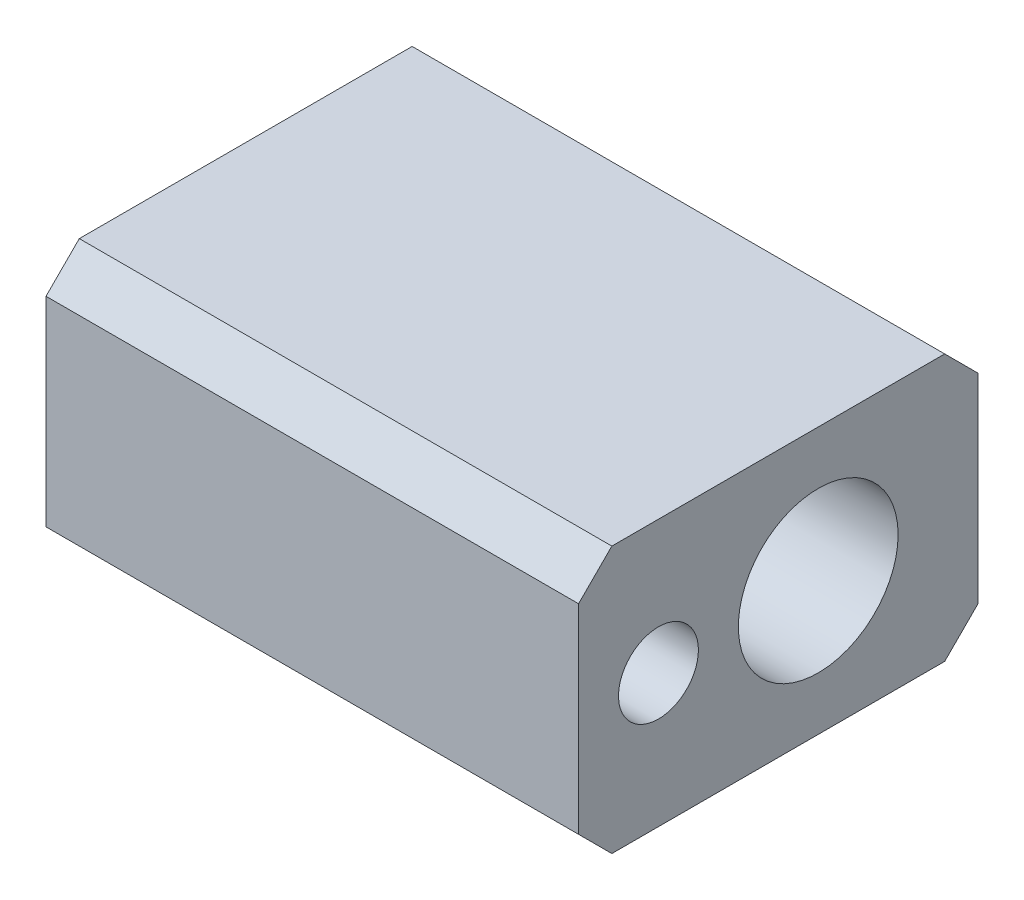
ISO-10303-21;
HEADER;
FILE_DESCRIPTION(('STEP AP214'),'2;1');
FILE_NAME('part.step','',(''),(''),'','','');
FILE_SCHEMA(('AUTOMOTIVE_DESIGN { 1 0 10303 214 1 1 1 1 }'));
ENDSEC;
DATA;
#1=APPLICATION_CONTEXT('core data for automotive mechanical design processes');
#2=APPLICATION_PROTOCOL_DEFINITION('international standard','automotive_design',2000,#1);
#3=PRODUCT_CONTEXT('',#1,'mechanical');
#4=PRODUCT('Part','Part','',(#3));
#5=PRODUCT_RELATED_PRODUCT_CATEGORY('part','',(#4));
#6=PRODUCT_DEFINITION_FORMATION('','',#4);
#7=PRODUCT_DEFINITION_CONTEXT('part definition',#1,'design');
#8=PRODUCT_DEFINITION('design','',#6,#7);
#9=PRODUCT_DEFINITION_SHAPE('','',#8);
#10=(LENGTH_UNIT() NAMED_UNIT(*) SI_UNIT(.MILLI.,.METRE.));
#11=(NAMED_UNIT(*) PLANE_ANGLE_UNIT() SI_UNIT($,.RADIAN.));
#12=(NAMED_UNIT(*) SI_UNIT($,.STERADIAN.) SOLID_ANGLE_UNIT());
#13=UNCERTAINTY_MEASURE_WITH_UNIT(LENGTH_MEASURE(1.E-05),#10,'distance_accuracy_value','');
#14=(GEOMETRIC_REPRESENTATION_CONTEXT(3) GLOBAL_UNCERTAINTY_ASSIGNED_CONTEXT((#13)) GLOBAL_UNIT_ASSIGNED_CONTEXT((#10,
#11,#12)) REPRESENTATION_CONTEXT('',''));
#15=CARTESIAN_POINT('',(0.,0.,0.));
#16=DIRECTION('',(0.,0.,1.));
#17=DIRECTION('',(1.,0.,0.));
#18=AXIS2_PLACEMENT_3D('',#15,#16,#17);
#19=CARTESIAN_POINT('',(101.6,0.,0.));
#20=DIRECTION('',(1.,0.,0.));
#21=DIRECTION('',(0.,0.,-1.));
#22=AXIS2_PLACEMENT_3D('',#19,#20,#21);
#23=PLANE('',#22);
#24=CARTESIAN_POINT('',(101.6,0.,-7.62000000000001));
#25=DIRECTION('',(1.,0.,0.));
#26=DIRECTION('',(0.,0.,-1.));
#27=AXIS2_PLACEMENT_3D('',#24,#25,#26);
#28=CIRCLE('',#27,15.24);
#29=CARTESIAN_POINT('',(101.6,0.,-22.86));
#30=VERTEX_POINT('',#29);
#31=EDGE_CURVE('E154',#30,#30,#28,.T.);
#32=ORIENTED_EDGE('',*,*,#31,.F.);
#33=EDGE_LOOP('',(#32));
#34=FACE_BOUND('',#33,.T.);
#35=DIRECTION('',(0.,1.,0.));
#36=VECTOR('',#35,1.);
#37=CARTESIAN_POINT('',(101.6,25.4,-38.1));
#38=LINE('',#37,#36);
#39=CARTESIAN_POINT('',(101.6,-19.05,-38.1));
#40=VERTEX_POINT('',#39);
#41=CARTESIAN_POINT('',(101.6,19.05,-38.1));
#42=VERTEX_POINT('',#41);
#43=EDGE_CURVE('E137',#40,#42,#38,.T.);
#44=ORIENTED_EDGE('',*,*,#43,.T.);
#45=DIRECTION('',(0.,-0.70710678118655,-0.707106781186545));
#46=VECTOR('',#45,1.);
#47=CARTESIAN_POINT('',(101.6,28.5749999999999,-28.5750000000001));
#48=LINE('',#47,#46);
#49=CARTESIAN_POINT('',(101.6,25.4,-31.75));
#50=VERTEX_POINT('',#49);
#51=EDGE_CURVE('E61',#42,#50,#48,.F.);
#52=ORIENTED_EDGE('',*,*,#51,.T.);
#53=DIRECTION('',(0.,0.,1.));
#54=VECTOR('',#53,1.);
#55=CARTESIAN_POINT('',(101.6,25.4,-38.1));
#56=LINE('',#55,#54);
#57=CARTESIAN_POINT('',(101.6,25.4,31.75));
#58=VERTEX_POINT('',#57);
#59=EDGE_CURVE('E198',#50,#58,#56,.T.);
#60=ORIENTED_EDGE('',*,*,#59,.T.);
#61=DIRECTION('',(0.,0.707106781186546,-0.707106781186549));
#62=VECTOR('',#61,1.);
#63=CARTESIAN_POINT('',(101.6,28.5750000000001,28.5749999999999));
#64=LINE('',#63,#62);
#65=CARTESIAN_POINT('',(101.6,19.05,38.1));
#66=VERTEX_POINT('',#65);
#67=EDGE_CURVE('E68',#58,#66,#64,.F.);
#68=ORIENTED_EDGE('',*,*,#67,.T.);
#69=DIRECTION('',(0.,-1.,0.));
#70=VECTOR('',#69,1.);
#71=CARTESIAN_POINT('',(101.6,25.4,38.1));
#72=LINE('',#71,#70);
#73=CARTESIAN_POINT('',(101.6,-19.05,38.1));
#74=VERTEX_POINT('',#73);
#75=EDGE_CURVE('E139',#66,#74,#72,.T.);
#76=ORIENTED_EDGE('',*,*,#75,.T.);
#77=DIRECTION('',(0.,0.707106781186547,0.707106781186548));
#78=VECTOR('',#77,1.);
#79=CARTESIAN_POINT('',(101.6,-28.575,28.575));
#80=LINE('',#79,#78);
#81=CARTESIAN_POINT('',(101.6,-25.4,31.75));
#82=VERTEX_POINT('',#81);
#83=EDGE_CURVE('E169',#74,#82,#80,.F.);
#84=ORIENTED_EDGE('',*,*,#83,.T.);
#85=DIRECTION('',(0.,0.,-1.));
#86=VECTOR('',#85,1.);
#87=CARTESIAN_POINT('',(101.6,-25.4,-38.1));
#88=LINE('',#87,#86);
#89=CARTESIAN_POINT('',(101.6,-25.4,-31.75));
#90=VERTEX_POINT('',#89);
#91=EDGE_CURVE('E159',#82,#90,#88,.T.);
#92=ORIENTED_EDGE('',*,*,#91,.T.);
#93=DIRECTION('',(0.,-0.707106781186548,0.707106781186548));
#94=VECTOR('',#93,1.);
#95=CARTESIAN_POINT('',(101.6,-28.575,-28.575));
#96=LINE('',#95,#94);
#97=EDGE_CURVE('E172',#90,#40,#96,.F.);
#98=ORIENTED_EDGE('',*,*,#97,.T.);
#99=EDGE_LOOP('',(#44,#52,#60,#68,#76,#84,#92,#98));
#100=FACE_BOUND('',#99,.T.);
#101=CARTESIAN_POINT('',(101.6,0.,22.86));
#102=DIRECTION('',(1.,0.,0.));
#103=DIRECTION('',(0.,0.,-1.));
#104=AXIS2_PLACEMENT_3D('',#101,#102,#103);
#105=CIRCLE('',#104,7.62);
#106=CARTESIAN_POINT('',(101.6,0.,15.24));
#107=VERTEX_POINT('',#106);
#108=EDGE_CURVE('E264',#107,#107,#105,.T.);
#109=ORIENTED_EDGE('',*,*,#108,.F.);
#110=EDGE_LOOP('',(#109));
#111=FACE_BOUND('',#110,.T.);
#112=ADVANCED_FACE('F51',(#34,#100,#111),#23,.T.);
#113=CARTESIAN_POINT('',(0.,0.,0.));
#114=DIRECTION('',(1.,0.,0.));
#115=DIRECTION('',(0.,0.,-1.));
#116=AXIS2_PLACEMENT_3D('',#113,#114,#115);
#117=PLANE('',#116);
#118=DIRECTION('',(0.,0.,1.));
#119=VECTOR('',#118,1.);
#120=CARTESIAN_POINT('',(0.,25.4,-38.1));
#121=LINE('',#120,#119);
#122=CARTESIAN_POINT('',(0.,25.4,-31.75));
#123=VERTEX_POINT('',#122);
#124=CARTESIAN_POINT('',(0.,25.4,31.75));
#125=VERTEX_POINT('',#124);
#126=EDGE_CURVE('E146',#123,#125,#121,.T.);
#127=ORIENTED_EDGE('',*,*,#126,.F.);
#128=DIRECTION('',(0.,0.70710678118655,0.707106781186545));
#129=VECTOR('',#128,1.);
#130=CARTESIAN_POINT('',(0.,25.4,-31.75));
#131=LINE('',#130,#129);
#132=CARTESIAN_POINT('',(0.,19.05,-38.1));
#133=VERTEX_POINT('',#132);
#134=EDGE_CURVE('E144',#123,#133,#131,.F.);
#135=ORIENTED_EDGE('',*,*,#134,.T.);
#136=DIRECTION('',(0.,1.,0.));
#137=VECTOR('',#136,1.);
#138=CARTESIAN_POINT('',(0.,25.4,-38.1));
#139=LINE('',#138,#137);
#140=CARTESIAN_POINT('',(0.,-19.05,-38.1));
#141=VERTEX_POINT('',#140);
#142=EDGE_CURVE('E136',#141,#133,#139,.T.);
#143=ORIENTED_EDGE('',*,*,#142,.F.);
#144=DIRECTION('',(0.,0.707106781186548,-0.707106781186548));
#145=VECTOR('',#144,1.);
#146=CARTESIAN_POINT('',(0.,-19.05,-38.1));
#147=LINE('',#146,#145);
#148=CARTESIAN_POINT('',(0.,-25.4,-31.75));
#149=VERTEX_POINT('',#148);
#150=EDGE_CURVE('E121',#141,#149,#147,.F.);
#151=ORIENTED_EDGE('',*,*,#150,.T.);
#152=DIRECTION('',(0.,0.,-1.));
#153=VECTOR('',#152,1.);
#154=CARTESIAN_POINT('',(0.,-25.4,-38.1));
#155=LINE('',#154,#153);
#156=CARTESIAN_POINT('',(0.,-25.4,31.75));
#157=VERTEX_POINT('',#156);
#158=EDGE_CURVE('E147',#157,#149,#155,.T.);
#159=ORIENTED_EDGE('',*,*,#158,.F.);
#160=DIRECTION('',(0.,-0.707106781186547,-0.707106781186548));
#161=VECTOR('',#160,1.);
#162=CARTESIAN_POINT('',(0.,-25.4,31.75));
#163=LINE('',#162,#161);
#164=CARTESIAN_POINT('',(0.,-19.05,38.1));
#165=VERTEX_POINT('',#164);
#166=EDGE_CURVE('E133',#157,#165,#163,.F.);
#167=ORIENTED_EDGE('',*,*,#166,.T.);
#168=DIRECTION('',(0.,-1.,0.));
#169=VECTOR('',#168,1.);
#170=CARTESIAN_POINT('',(0.,25.4,38.1));
#171=LINE('',#170,#169);
#172=CARTESIAN_POINT('',(0.,19.05,38.1));
#173=VERTEX_POINT('',#172);
#174=EDGE_CURVE('E152',#173,#165,#171,.T.);
#175=ORIENTED_EDGE('',*,*,#174,.F.);
#176=DIRECTION('',(0.,-0.707106781186546,0.707106781186549));
#177=VECTOR('',#176,1.);
#178=CARTESIAN_POINT('',(0.,19.05,38.1));
#179=LINE('',#178,#177);
#180=EDGE_CURVE('E186',#173,#125,#179,.F.);
#181=ORIENTED_EDGE('',*,*,#180,.T.);
#182=EDGE_LOOP('',(#127,#135,#143,#151,#159,#167,#175,#181));
#183=FACE_BOUND('',#182,.T.);
#184=CARTESIAN_POINT('',(0.,0.,-7.62000000000001));
#185=DIRECTION('',(1.,0.,0.));
#186=DIRECTION('',(0.,0.,-1.));
#187=AXIS2_PLACEMENT_3D('',#184,#185,#186);
#188=CIRCLE('',#187,15.24);
#189=CARTESIAN_POINT('',(0.,0.,-22.86));
#190=VERTEX_POINT('',#189);
#191=EDGE_CURVE('E272',#190,#190,#188,.T.);
#192=ORIENTED_EDGE('',*,*,#191,.T.);
#193=EDGE_LOOP('',(#192));
#194=FACE_BOUND('',#193,.T.);
#195=CARTESIAN_POINT('',(0.,0.,22.86));
#196=DIRECTION('',(1.,0.,0.));
#197=DIRECTION('',(0.,0.,-1.));
#198=AXIS2_PLACEMENT_3D('',#195,#196,#197);
#199=CIRCLE('',#198,7.62);
#200=CARTESIAN_POINT('',(0.,0.,15.24));
#201=VERTEX_POINT('',#200);
#202=EDGE_CURVE('E267',#201,#201,#199,.T.);
#203=ORIENTED_EDGE('',*,*,#202,.T.);
#204=EDGE_LOOP('',(#203));
#205=FACE_BOUND('',#204,.T.);
#206=ADVANCED_FACE('F142',(#183,#194,#205),#117,.F.);
#207=CARTESIAN_POINT('',(101.6,-25.4,-38.1));
#208=DIRECTION('',(0.,1.,0.));
#209=DIRECTION('',(0.,0.,1.));
#210=AXIS2_PLACEMENT_3D('',#207,#208,#209);
#211=PLANE('',#210);
#212=ORIENTED_EDGE('',*,*,#158,.T.);
#213=DIRECTION('',(1.,0.,0.));
#214=VECTOR('',#213,1.);
#215=CARTESIAN_POINT('',(101.6,-25.4,-31.75));
#216=LINE('',#215,#214);
#217=EDGE_CURVE('E126',#149,#90,#216,.T.);
#218=ORIENTED_EDGE('',*,*,#217,.T.);
#219=ORIENTED_EDGE('',*,*,#91,.F.);
#220=DIRECTION('',(-1.,0.,0.));
#221=VECTOR('',#220,1.);
#222=CARTESIAN_POINT('',(101.6,-25.4,31.75));
#223=LINE('',#222,#221);
#224=EDGE_CURVE('E132',#82,#157,#223,.T.);
#225=ORIENTED_EDGE('',*,*,#224,.T.);
#226=EDGE_LOOP('',(#212,#218,#219,#225));
#227=FACE_BOUND('',#226,.T.);
#228=ADVANCED_FACE('F224',(#227),#211,.F.);
#229=CARTESIAN_POINT('',(101.6,25.4,-38.1));
#230=DIRECTION('',(0.,0.,1.));
#231=DIRECTION('',(0.,-1.,0.));
#232=AXIS2_PLACEMENT_3D('',#229,#230,#231);
#233=PLANE('',#232);
#234=ORIENTED_EDGE('',*,*,#142,.T.);
#235=DIRECTION('',(1.,0.,0.));
#236=VECTOR('',#235,1.);
#237=CARTESIAN_POINT('',(101.6,19.05,-38.1));
#238=LINE('',#237,#236);
#239=EDGE_CURVE('E76',#133,#42,#238,.T.);
#240=ORIENTED_EDGE('',*,*,#239,.T.);
#241=ORIENTED_EDGE('',*,*,#43,.F.);
#242=DIRECTION('',(-1.,0.,0.));
#243=VECTOR('',#242,1.);
#244=CARTESIAN_POINT('',(101.6,-19.05,-38.1));
#245=LINE('',#244,#243);
#246=EDGE_CURVE('E125',#40,#141,#245,.T.);
#247=ORIENTED_EDGE('',*,*,#246,.T.);
#248=EDGE_LOOP('',(#234,#240,#241,#247));
#249=FACE_BOUND('',#248,.T.);
#250=ADVANCED_FACE('F135',(#249),#233,.F.);
#251=CARTESIAN_POINT('',(101.6,25.4,-38.1));
#252=DIRECTION('',(0.,-1.,0.));
#253=DIRECTION('',(0.,0.,-1.));
#254=AXIS2_PLACEMENT_3D('',#251,#252,#253);
#255=PLANE('',#254);
#256=ORIENTED_EDGE('',*,*,#59,.F.);
#257=DIRECTION('',(-1.,0.,0.));
#258=VECTOR('',#257,1.);
#259=CARTESIAN_POINT('',(101.6,25.4,-31.75));
#260=LINE('',#259,#258);
#261=EDGE_CURVE('E182',#50,#123,#260,.T.);
#262=ORIENTED_EDGE('',*,*,#261,.T.);
#263=ORIENTED_EDGE('',*,*,#126,.T.);
#264=DIRECTION('',(1.,0.,0.));
#265=VECTOR('',#264,1.);
#266=CARTESIAN_POINT('',(101.6,25.4,31.75));
#267=LINE('',#266,#265);
#268=EDGE_CURVE('E179',#125,#58,#267,.T.);
#269=ORIENTED_EDGE('',*,*,#268,.T.);
#270=EDGE_LOOP('',(#256,#262,#263,#269));
#271=FACE_BOUND('',#270,.T.);
#272=ADVANCED_FACE('F202',(#271),#255,.F.);
#273=CARTESIAN_POINT('',(101.6,25.4,38.1));
#274=DIRECTION('',(0.,0.,-1.));
#275=DIRECTION('',(-1.,0.,0.));
#276=AXIS2_PLACEMENT_3D('',#273,#274,#275);
#277=PLANE('',#276);
#278=ORIENTED_EDGE('',*,*,#75,.F.);
#279=DIRECTION('',(-1.,0.,0.));
#280=VECTOR('',#279,1.);
#281=CARTESIAN_POINT('',(101.6,19.05,38.1));
#282=LINE('',#281,#280);
#283=EDGE_CURVE('E13',#66,#173,#282,.T.);
#284=ORIENTED_EDGE('',*,*,#283,.T.);
#285=ORIENTED_EDGE('',*,*,#174,.T.);
#286=DIRECTION('',(1.,0.,0.));
#287=VECTOR('',#286,1.);
#288=CARTESIAN_POINT('',(101.6,-19.05,38.1));
#289=LINE('',#288,#287);
#290=EDGE_CURVE('E175',#165,#74,#289,.T.);
#291=ORIENTED_EDGE('',*,*,#290,.T.);
#292=EDGE_LOOP('',(#278,#284,#285,#291));
#293=FACE_BOUND('',#292,.T.);
#294=ADVANCED_FACE('F231',(#293),#277,.F.);
#295=CARTESIAN_POINT('',(101.6,0.,-7.62000000000001));
#296=DIRECTION('',(-1.,0.,0.));
#297=DIRECTION('',(0.,0.,1.));
#298=AXIS2_PLACEMENT_3D('',#295,#296,#297);
#299=CYLINDRICAL_SURFACE('',#298,15.24);
#300=ORIENTED_EDGE('',*,*,#31,.T.);
#301=EDGE_LOOP('',(#300));
#302=FACE_BOUND('',#301,.T.);
#303=ORIENTED_EDGE('',*,*,#191,.F.);
#304=EDGE_LOOP('',(#303));
#305=FACE_BOUND('',#304,.T.);
#306=ADVANCED_FACE('F228',(#302,#305),#299,.F.);
#307=CARTESIAN_POINT('',(101.6,0.,22.86));
#308=DIRECTION('',(-1.,0.,0.));
#309=DIRECTION('',(0.,0.,1.));
#310=AXIS2_PLACEMENT_3D('',#307,#308,#309);
#311=CYLINDRICAL_SURFACE('',#310,7.62);
#312=ORIENTED_EDGE('',*,*,#108,.T.);
#313=EDGE_LOOP('',(#312));
#314=FACE_BOUND('',#313,.T.);
#315=ORIENTED_EDGE('',*,*,#202,.F.);
#316=EDGE_LOOP('',(#315));
#317=FACE_BOUND('',#316,.T.);
#318=ADVANCED_FACE('F246',(#314,#317),#311,.F.);
#319=CARTESIAN_POINT('',(101.6,-19.05,-38.1));
#320=DIRECTION('',(0.,0.707106781186547,0.707106781186547));
#321=DIRECTION('',(-1.,0.,0.));
#322=AXIS2_PLACEMENT_3D('',#319,#320,#321);
#323=PLANE('',#322);
#324=ORIENTED_EDGE('',*,*,#97,.F.);
#325=ORIENTED_EDGE('',*,*,#217,.F.);
#326=ORIENTED_EDGE('',*,*,#150,.F.);
#327=ORIENTED_EDGE('',*,*,#246,.F.);
#328=EDGE_LOOP('',(#324,#325,#326,#327));
#329=FACE_BOUND('',#328,.T.);
#330=ADVANCED_FACE('F124',(#329),#323,.F.);
#331=CARTESIAN_POINT('',(101.6,-25.4,31.75));
#332=DIRECTION('',(0.,0.707106781186548,-0.707106781186547));
#333=DIRECTION('',(-1.,0.,0.));
#334=AXIS2_PLACEMENT_3D('',#331,#332,#333);
#335=PLANE('',#334);
#336=ORIENTED_EDGE('',*,*,#83,.F.);
#337=ORIENTED_EDGE('',*,*,#290,.F.);
#338=ORIENTED_EDGE('',*,*,#166,.F.);
#339=ORIENTED_EDGE('',*,*,#224,.F.);
#340=EDGE_LOOP('',(#336,#337,#338,#339));
#341=FACE_BOUND('',#340,.T.);
#342=ADVANCED_FACE('F208',(#341),#335,.F.);
#343=CARTESIAN_POINT('',(101.6,25.4,-31.75));
#344=DIRECTION('',(0.,-0.707106781186545,0.70710678118655));
#345=DIRECTION('',(-1.,0.,0.));
#346=AXIS2_PLACEMENT_3D('',#343,#344,#345);
#347=PLANE('',#346);
#348=ORIENTED_EDGE('',*,*,#51,.F.);
#349=ORIENTED_EDGE('',*,*,#239,.F.);
#350=ORIENTED_EDGE('',*,*,#134,.F.);
#351=ORIENTED_EDGE('',*,*,#261,.F.);
#352=EDGE_LOOP('',(#348,#349,#350,#351));
#353=FACE_BOUND('',#352,.T.);
#354=ADVANCED_FACE('F206',(#353),#347,.F.);
#355=CARTESIAN_POINT('',(101.6,19.05,38.1));
#356=DIRECTION('',(0.,-0.707106781186549,-0.707106781186546));
#357=DIRECTION('',(-1.,0.,0.));
#358=AXIS2_PLACEMENT_3D('',#355,#356,#357);
#359=PLANE('',#358);
#360=ORIENTED_EDGE('',*,*,#67,.F.);
#361=ORIENTED_EDGE('',*,*,#268,.F.);
#362=ORIENTED_EDGE('',*,*,#180,.F.);
#363=ORIENTED_EDGE('',*,*,#283,.F.);
#364=EDGE_LOOP('',(#360,#361,#362,#363));
#365=FACE_BOUND('',#364,.T.);
#366=ADVANCED_FACE('F54',(#365),#359,.F.);
#367=CLOSED_SHELL('',(#112,#206,#228,#250,#272,#294,#306,#318,#330,#342,#354,#366));
#368=MANIFOLD_SOLID_BREP('B2',#367);
#369=ADVANCED_BREP_SHAPE_REPRESENTATION('',(#18,#368),#14);
#370=SHAPE_DEFINITION_REPRESENTATION(#9,#369);
ENDSEC;
END-ISO-10303-21;
